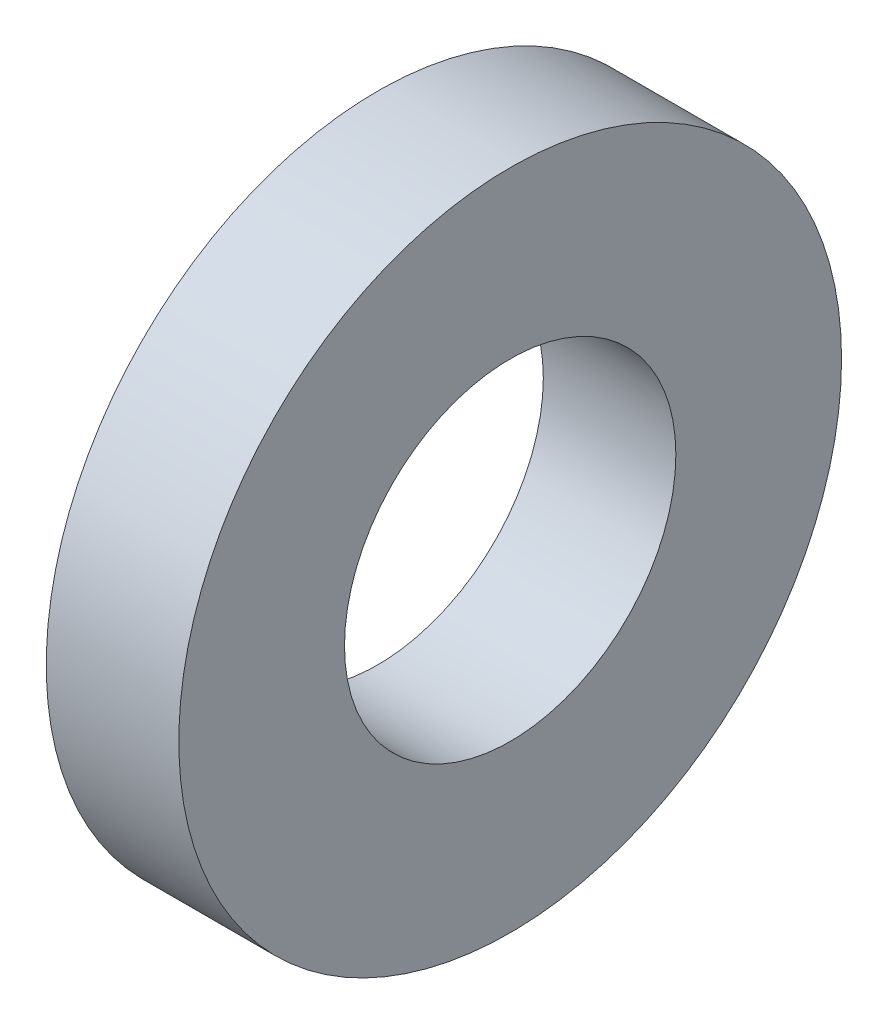
ISO-10303-21;
HEADER;
FILE_DESCRIPTION(('STEP AP214'),'2;1');
FILE_NAME('part.step','',(''),(''),'','','');
FILE_SCHEMA(('AUTOMOTIVE_DESIGN { 1 0 10303 214 1 1 1 1 }'));
ENDSEC;
DATA;
#1=APPLICATION_CONTEXT('core data for automotive mechanical design processes');
#2=APPLICATION_PROTOCOL_DEFINITION('international standard','automotive_design',2000,#1);
#3=PRODUCT_CONTEXT('',#1,'mechanical');
#4=PRODUCT('Part','Part','',(#3));
#5=PRODUCT_RELATED_PRODUCT_CATEGORY('part','',(#4));
#6=PRODUCT_DEFINITION_FORMATION('','',#4);
#7=PRODUCT_DEFINITION_CONTEXT('part definition',#1,'design');
#8=PRODUCT_DEFINITION('design','',#6,#7);
#9=PRODUCT_DEFINITION_SHAPE('','',#8);
#10=(LENGTH_UNIT() NAMED_UNIT(*) SI_UNIT(.MILLI.,.METRE.));
#11=(NAMED_UNIT(*) PLANE_ANGLE_UNIT() SI_UNIT($,.RADIAN.));
#12=(NAMED_UNIT(*) SI_UNIT($,.STERADIAN.) SOLID_ANGLE_UNIT());
#13=UNCERTAINTY_MEASURE_WITH_UNIT(LENGTH_MEASURE(1.E-05),#10,'distance_accuracy_value','');
#14=(GEOMETRIC_REPRESENTATION_CONTEXT(3) GLOBAL_UNCERTAINTY_ASSIGNED_CONTEXT((#13)) GLOBAL_UNIT_ASSIGNED_CONTEXT((#10,
#11,#12)) REPRESENTATION_CONTEXT('',''));
#15=CARTESIAN_POINT('',(0.,0.,0.));
#16=DIRECTION('',(0.,0.,1.));
#17=DIRECTION('',(1.,0.,0.));
#18=AXIS2_PLACEMENT_3D('',#15,#16,#17);
#19=CARTESIAN_POINT('',(1.,0.,0.));
#20=DIRECTION('',(1.,0.,0.));
#21=DIRECTION('',(0.,0.,-1.));
#22=AXIS2_PLACEMENT_3D('',#19,#20,#21);
#23=PLANE('',#22);
#24=CARTESIAN_POINT('',(1.,0.,0.));
#25=DIRECTION('',(1.,0.,0.));
#26=DIRECTION('',(0.,0.,-1.));
#27=AXIS2_PLACEMENT_3D('',#24,#25,#26);
#28=CIRCLE('',#27,2.5);
#29=CARTESIAN_POINT('',(1.,0.,-2.5));
#30=VERTEX_POINT('',#29);
#31=EDGE_CURVE('E10',#30,#30,#28,.T.);
#32=ORIENTED_EDGE('',*,*,#31,.T.);
#33=EDGE_LOOP('',(#32));
#34=FACE_BOUND('',#33,.T.);
#35=CARTESIAN_POINT('',(1.,0.,0.));
#36=DIRECTION('',(1.,0.,0.));
#37=DIRECTION('',(0.,0.,-1.));
#38=AXIS2_PLACEMENT_3D('',#35,#36,#37);
#39=CIRCLE('',#38,1.25);
#40=CARTESIAN_POINT('',(1.,0.,-1.25));
#41=VERTEX_POINT('',#40);
#42=EDGE_CURVE('E42',#41,#41,#39,.T.);
#43=ORIENTED_EDGE('',*,*,#42,.F.);
#44=EDGE_LOOP('',(#43));
#45=FACE_BOUND('',#44,.T.);
#46=ADVANCED_FACE('F31',(#34,#45),#23,.T.);
#47=CARTESIAN_POINT('',(0.,0.,0.));
#48=DIRECTION('',(1.,0.,0.));
#49=DIRECTION('',(0.,0.,-1.));
#50=AXIS2_PLACEMENT_3D('',#47,#48,#49);
#51=PLANE('',#50);
#52=CARTESIAN_POINT('',(0.,0.,0.));
#53=DIRECTION('',(1.,0.,0.));
#54=DIRECTION('',(0.,0.,-1.));
#55=AXIS2_PLACEMENT_3D('',#52,#53,#54);
#56=CIRCLE('',#55,2.5);
#57=CARTESIAN_POINT('',(0.,0.,-2.5));
#58=VERTEX_POINT('',#57);
#59=EDGE_CURVE('E35',#58,#58,#56,.T.);
#60=ORIENTED_EDGE('',*,*,#59,.F.);
#61=EDGE_LOOP('',(#60));
#62=FACE_BOUND('',#61,.T.);
#63=CARTESIAN_POINT('',(0.,0.,0.));
#64=DIRECTION('',(1.,0.,0.));
#65=DIRECTION('',(0.,0.,-1.));
#66=AXIS2_PLACEMENT_3D('',#63,#64,#65);
#67=CIRCLE('',#66,1.25);
#68=CARTESIAN_POINT('',(0.,0.,-1.25));
#69=VERTEX_POINT('',#68);
#70=EDGE_CURVE('E44',#69,#69,#67,.T.);
#71=ORIENTED_EDGE('',*,*,#70,.T.);
#72=EDGE_LOOP('',(#71));
#73=FACE_BOUND('',#72,.T.);
#74=ADVANCED_FACE('F54',(#62,#73),#51,.F.);
#75=CARTESIAN_POINT('',(1.,0.,0.));
#76=DIRECTION('',(-1.,0.,0.));
#77=DIRECTION('',(0.,0.,1.));
#78=AXIS2_PLACEMENT_3D('',#75,#76,#77);
#79=CYLINDRICAL_SURFACE('',#78,2.5);
#80=ORIENTED_EDGE('',*,*,#31,.F.);
#81=EDGE_LOOP('',(#80));
#82=FACE_BOUND('',#81,.T.);
#83=ORIENTED_EDGE('',*,*,#59,.T.);
#84=EDGE_LOOP('',(#83));
#85=FACE_BOUND('',#84,.T.);
#86=ADVANCED_FACE('F33',(#82,#85),#79,.T.);
#87=CARTESIAN_POINT('',(1.,0.,0.));
#88=DIRECTION('',(-1.,0.,0.));
#89=DIRECTION('',(0.,0.,1.));
#90=AXIS2_PLACEMENT_3D('',#87,#88,#89);
#91=CYLINDRICAL_SURFACE('',#90,1.25);
#92=ORIENTED_EDGE('',*,*,#42,.T.);
#93=EDGE_LOOP('',(#92));
#94=FACE_BOUND('',#93,.T.);
#95=ORIENTED_EDGE('',*,*,#70,.F.);
#96=EDGE_LOOP('',(#95));
#97=FACE_BOUND('',#96,.T.);
#98=ADVANCED_FACE('F50',(#94,#97),#91,.F.);
#99=CLOSED_SHELL('',(#46,#74,#86,#98));
#100=MANIFOLD_SOLID_BREP('B2',#99);
#101=ADVANCED_BREP_SHAPE_REPRESENTATION('',(#18,#100),#14);
#102=SHAPE_DEFINITION_REPRESENTATION(#9,#101);
ENDSEC;
END-ISO-10303-21;
